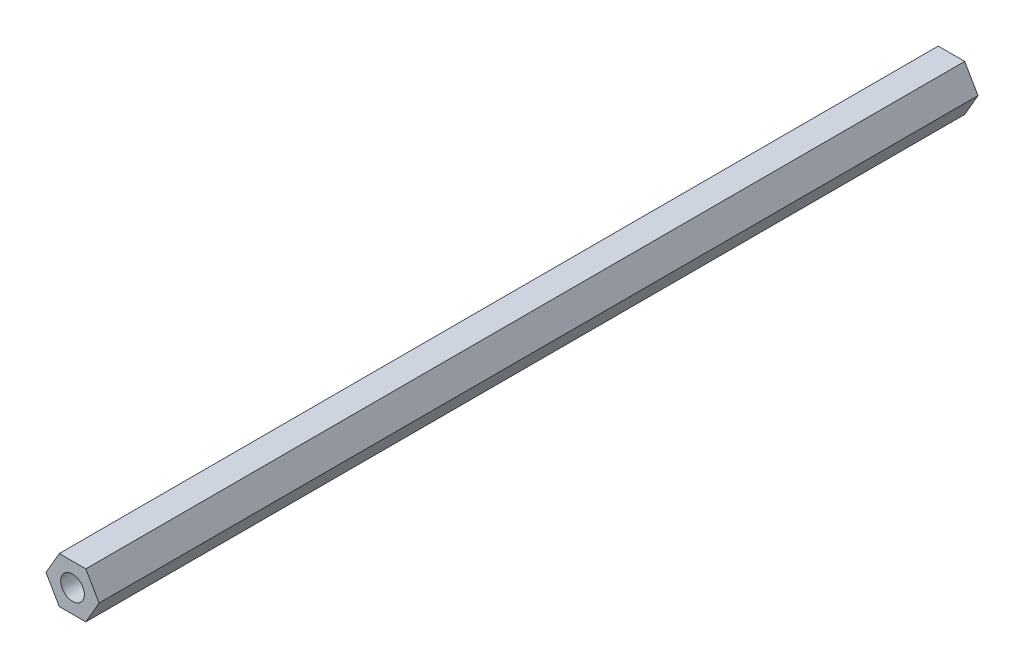
ISO-10303-21;
HEADER;
FILE_DESCRIPTION(('STEP AP214'),'2;1');
FILE_NAME('part.step','',(''),(''),'','','');
FILE_SCHEMA(('AUTOMOTIVE_DESIGN { 1 0 10303 214 1 1 1 1 }'));
ENDSEC;
DATA;
#1=APPLICATION_CONTEXT('core data for automotive mechanical design processes');
#2=APPLICATION_PROTOCOL_DEFINITION('international standard','automotive_design',2000,#1);
#3=PRODUCT_CONTEXT('',#1,'mechanical');
#4=PRODUCT('Part','Part','',(#3));
#5=PRODUCT_RELATED_PRODUCT_CATEGORY('part','',(#4));
#6=PRODUCT_DEFINITION_FORMATION('','',#4);
#7=PRODUCT_DEFINITION_CONTEXT('part definition',#1,'design');
#8=PRODUCT_DEFINITION('design','',#6,#7);
#9=PRODUCT_DEFINITION_SHAPE('','',#8);
#10=(LENGTH_UNIT() NAMED_UNIT(*) SI_UNIT(.MILLI.,.METRE.));
#11=(NAMED_UNIT(*) PLANE_ANGLE_UNIT() SI_UNIT($,.RADIAN.));
#12=(NAMED_UNIT(*) SI_UNIT($,.STERADIAN.) SOLID_ANGLE_UNIT());
#13=UNCERTAINTY_MEASURE_WITH_UNIT(LENGTH_MEASURE(1.E-05),#10,'distance_accuracy_value','');
#14=(GEOMETRIC_REPRESENTATION_CONTEXT(3) GLOBAL_UNCERTAINTY_ASSIGNED_CONTEXT((#13)) GLOBAL_UNIT_ASSIGNED_CONTEXT((#10,
#11,#12)) REPRESENTATION_CONTEXT('',''));
#15=CARTESIAN_POINT('',(0.,0.,0.));
#16=DIRECTION('',(0.,0.,1.));
#17=DIRECTION('',(1.,0.,0.));
#18=AXIS2_PLACEMENT_3D('',#15,#16,#17);
#19=CARTESIAN_POINT('',(0.,0.,242.824));
#20=DIRECTION('',(0.,0.,1.));
#21=DIRECTION('',(1.,0.,0.));
#22=AXIS2_PLACEMENT_3D('',#19,#20,#21);
#23=PLANE('',#22);
#24=DIRECTION('',(-0.499999999999995,-0.866025403784442,0.));
#25=VECTOR('',#24,1.);
#26=CARTESIAN_POINT('',(-3.6661742093542,6.34999999999996,242.824));
#27=LINE('',#26,#25);
#28=CARTESIAN_POINT('',(-3.6661742093542,6.34999999999996,242.824));
#29=VERTEX_POINT('',#28);
#30=CARTESIAN_POINT('',(-7.33234841870825,0.,242.824));
#31=VERTEX_POINT('',#30);
#32=EDGE_CURVE('E128',#29,#31,#27,.T.);
#33=ORIENTED_EDGE('',*,*,#32,.T.);
#34=DIRECTION('',(0.500000000000001,-0.866025403784438,0.));
#35=VECTOR('',#34,1.);
#36=CARTESIAN_POINT('',(-7.33234841870825,0.,242.824));
#37=LINE('',#36,#35);
#38=CARTESIAN_POINT('',(-3.66617420935411,-6.35000000000001,242.824));
#39=VERTEX_POINT('',#38);
#40=EDGE_CURVE('E86',#31,#39,#37,.T.);
#41=ORIENTED_EDGE('',*,*,#40,.T.);
#42=DIRECTION('',(1.,0.,0.));
#43=VECTOR('',#42,1.);
#44=CARTESIAN_POINT('',(-3.66617420935411,-6.35000000000001,242.824));
#45=LINE('',#44,#43);
#46=CARTESIAN_POINT('',(3.66617420935415,-6.34999999999998,242.824));
#47=VERTEX_POINT('',#46);
#48=EDGE_CURVE('E99',#39,#47,#45,.T.);
#49=ORIENTED_EDGE('',*,*,#48,.T.);
#50=DIRECTION('',(0.499999999999995,0.866025403784442,0.));
#51=VECTOR('',#50,1.);
#52=CARTESIAN_POINT('',(3.66617420935415,-6.34999999999998,242.824));
#53=LINE('',#52,#51);
#54=CARTESIAN_POINT('',(7.33234841870825,0.,242.824));
#55=VERTEX_POINT('',#54);
#56=EDGE_CURVE('E93',#47,#55,#53,.T.);
#57=ORIENTED_EDGE('',*,*,#56,.T.);
#58=DIRECTION('',(-0.500000000000007,0.866025403784434,0.));
#59=VECTOR('',#58,1.);
#60=CARTESIAN_POINT('',(7.33234841870825,0.,242.824));
#61=LINE('',#60,#59);
#62=CARTESIAN_POINT('',(3.66617420935407,6.35000000000003,242.824));
#63=VERTEX_POINT('',#62);
#64=EDGE_CURVE('E97',#55,#63,#61,.T.);
#65=ORIENTED_EDGE('',*,*,#64,.T.);
#66=DIRECTION('',(-1.,0.,0.));
#67=VECTOR('',#66,1.);
#68=CARTESIAN_POINT('',(3.66617420935407,6.35000000000003,242.824));
#69=LINE('',#68,#67);
#70=EDGE_CURVE('E49',#63,#29,#69,.T.);
#71=ORIENTED_EDGE('',*,*,#70,.T.);
#72=EDGE_LOOP('',(#33,#41,#49,#57,#65,#71));
#73=FACE_BOUND('',#72,.T.);
#74=CARTESIAN_POINT('',(0.,0.,242.824));
#75=DIRECTION('',(0.,0.,1.));
#76=DIRECTION('',(1.,0.,0.));
#77=AXIS2_PLACEMENT_3D('',#74,#75,#76);
#78=CIRCLE('',#77,3.2639);
#79=CARTESIAN_POINT('',(3.2639,0.,242.824));
#80=VERTEX_POINT('',#79);
#81=EDGE_CURVE('E121',#80,#80,#78,.T.);
#82=ORIENTED_EDGE('',*,*,#81,.F.);
#83=EDGE_LOOP('',(#82));
#84=FACE_BOUND('',#83,.T.);
#85=ADVANCED_FACE('F32',(#73,#84),#23,.T.);
#86=CARTESIAN_POINT('',(0.,0.,0.));
#87=DIRECTION('',(0.,0.,1.));
#88=DIRECTION('',(1.,0.,0.));
#89=AXIS2_PLACEMENT_3D('',#86,#87,#88);
#90=PLANE('',#89);
#91=DIRECTION('',(-0.499999999999995,-0.866025403784442,0.));
#92=VECTOR('',#91,1.);
#93=CARTESIAN_POINT('',(-3.6661742093542,6.34999999999996,0.));
#94=LINE('',#93,#92);
#95=CARTESIAN_POINT('',(-3.6661742093542,6.34999999999996,0.));
#96=VERTEX_POINT('',#95);
#97=CARTESIAN_POINT('',(-7.33234841870825,0.,0.));
#98=VERTEX_POINT('',#97);
#99=EDGE_CURVE('E117',#96,#98,#94,.T.);
#100=ORIENTED_EDGE('',*,*,#99,.F.);
#101=DIRECTION('',(-1.,0.,0.));
#102=VECTOR('',#101,1.);
#103=CARTESIAN_POINT('',(3.66617420935407,6.35000000000003,0.));
#104=LINE('',#103,#102);
#105=CARTESIAN_POINT('',(3.66617420935407,6.35000000000003,0.));
#106=VERTEX_POINT('',#105);
#107=EDGE_CURVE('E78',#106,#96,#104,.T.);
#108=ORIENTED_EDGE('',*,*,#107,.F.);
#109=DIRECTION('',(-0.500000000000007,0.866025403784434,0.));
#110=VECTOR('',#109,1.);
#111=CARTESIAN_POINT('',(7.33234841870825,0.,0.));
#112=LINE('',#111,#110);
#113=CARTESIAN_POINT('',(7.33234841870825,0.,0.));
#114=VERTEX_POINT('',#113);
#115=EDGE_CURVE('E72',#114,#106,#112,.T.);
#116=ORIENTED_EDGE('',*,*,#115,.F.);
#117=DIRECTION('',(0.499999999999995,0.866025403784442,0.));
#118=VECTOR('',#117,1.);
#119=CARTESIAN_POINT('',(3.66617420935415,-6.34999999999998,0.));
#120=LINE('',#119,#118);
#121=CARTESIAN_POINT('',(3.66617420935415,-6.34999999999998,0.));
#122=VERTEX_POINT('',#121);
#123=EDGE_CURVE('E107',#122,#114,#120,.T.);
#124=ORIENTED_EDGE('',*,*,#123,.F.);
#125=DIRECTION('',(1.,0.,0.));
#126=VECTOR('',#125,1.);
#127=CARTESIAN_POINT('',(-3.66617420935411,-6.35000000000001,0.));
#128=LINE('',#127,#126);
#129=CARTESIAN_POINT('',(-3.66617420935411,-6.35000000000001,0.));
#130=VERTEX_POINT('',#129);
#131=EDGE_CURVE('E123',#130,#122,#128,.T.);
#132=ORIENTED_EDGE('',*,*,#131,.F.);
#133=DIRECTION('',(0.500000000000001,-0.866025403784438,0.));
#134=VECTOR('',#133,1.);
#135=CARTESIAN_POINT('',(-7.33234841870825,0.,0.));
#136=LINE('',#135,#134);
#137=EDGE_CURVE('E120',#98,#130,#136,.T.);
#138=ORIENTED_EDGE('',*,*,#137,.F.);
#139=EDGE_LOOP('',(#100,#108,#116,#124,#132,#138));
#140=FACE_BOUND('',#139,.T.);
#141=CARTESIAN_POINT('',(0.,0.,0.));
#142=DIRECTION('',(0.,0.,1.));
#143=DIRECTION('',(1.,0.,0.));
#144=AXIS2_PLACEMENT_3D('',#141,#142,#143);
#145=CIRCLE('',#144,3.2639);
#146=CARTESIAN_POINT('',(3.2639,0.,0.));
#147=VERTEX_POINT('',#146);
#148=EDGE_CURVE('E221',#147,#147,#145,.T.);
#149=ORIENTED_EDGE('',*,*,#148,.T.);
#150=EDGE_LOOP('',(#149));
#151=FACE_BOUND('',#150,.T.);
#152=ADVANCED_FACE('F137',(#140,#151),#90,.F.);
#153=CARTESIAN_POINT('',(-3.6661742093542,6.34999999999996,242.824));
#154=DIRECTION('',(0.866025403784441,-0.499999999999995,0.));
#155=DIRECTION('',(0.499999999999995,0.866025403784442,0.));
#156=AXIS2_PLACEMENT_3D('',#153,#154,#155);
#157=PLANE('',#156);
#158=ORIENTED_EDGE('',*,*,#99,.T.);
#159=DIRECTION('',(0.,0.,-1.));
#160=VECTOR('',#159,1.);
#161=CARTESIAN_POINT('',(-7.33234841870825,0.,242.824));
#162=LINE('',#161,#160);
#163=EDGE_CURVE('E11',#31,#98,#162,.T.);
#164=ORIENTED_EDGE('',*,*,#163,.F.);
#165=ORIENTED_EDGE('',*,*,#32,.F.);
#166=DIRECTION('',(0.,0.,-1.));
#167=VECTOR('',#166,1.);
#168=CARTESIAN_POINT('',(-3.6661742093542,6.34999999999996,242.824));
#169=LINE('',#168,#167);
#170=EDGE_CURVE('E113',#29,#96,#169,.T.);
#171=ORIENTED_EDGE('',*,*,#170,.T.);
#172=EDGE_LOOP('',(#158,#164,#165,#171));
#173=FACE_BOUND('',#172,.T.);
#174=ADVANCED_FACE('F34',(#173),#157,.F.);
#175=CARTESIAN_POINT('',(-7.33234841870825,0.,242.824));
#176=DIRECTION('',(0.866025403784438,0.500000000000001,0.));
#177=DIRECTION('',(-0.500000000000001,0.866025403784438,0.));
#178=AXIS2_PLACEMENT_3D('',#175,#176,#177);
#179=PLANE('',#178);
#180=ORIENTED_EDGE('',*,*,#137,.T.);
#181=DIRECTION('',(0.,0.,-1.));
#182=VECTOR('',#181,1.);
#183=CARTESIAN_POINT('',(-3.66617420935411,-6.35000000000001,242.824));
#184=LINE('',#183,#182);
#185=EDGE_CURVE('E41',#39,#130,#184,.T.);
#186=ORIENTED_EDGE('',*,*,#185,.F.);
#187=ORIENTED_EDGE('',*,*,#40,.F.);
#188=ORIENTED_EDGE('',*,*,#163,.T.);
#189=EDGE_LOOP('',(#180,#186,#187,#188));
#190=FACE_BOUND('',#189,.T.);
#191=ADVANCED_FACE('F162',(#190),#179,.F.);
#192=CARTESIAN_POINT('',(-3.66617420935411,-6.35000000000001,242.824));
#193=DIRECTION('',(0.,1.,0.));
#194=DIRECTION('',(-1.,0.,0.));
#195=AXIS2_PLACEMENT_3D('',#192,#193,#194);
#196=PLANE('',#195);
#197=ORIENTED_EDGE('',*,*,#131,.T.);
#198=DIRECTION('',(0.,0.,-1.));
#199=VECTOR('',#198,1.);
#200=CARTESIAN_POINT('',(3.66617420935415,-6.34999999999998,242.824));
#201=LINE('',#200,#199);
#202=EDGE_CURVE('E108',#47,#122,#201,.T.);
#203=ORIENTED_EDGE('',*,*,#202,.F.);
#204=ORIENTED_EDGE('',*,*,#48,.F.);
#205=ORIENTED_EDGE('',*,*,#185,.T.);
#206=EDGE_LOOP('',(#197,#203,#204,#205));
#207=FACE_BOUND('',#206,.T.);
#208=ADVANCED_FACE('F134',(#207),#196,.F.);
#209=CARTESIAN_POINT('',(3.66617420935415,-6.34999999999998,242.824));
#210=DIRECTION('',(-0.866025403784441,0.499999999999995,0.));
#211=DIRECTION('',(-0.499999999999995,-0.866025403784442,0.));
#212=AXIS2_PLACEMENT_3D('',#209,#210,#211);
#213=PLANE('',#212);
#214=ORIENTED_EDGE('',*,*,#123,.T.);
#215=DIRECTION('',(0.,0.,-1.));
#216=VECTOR('',#215,1.);
#217=CARTESIAN_POINT('',(7.33234841870825,0.,242.824));
#218=LINE('',#217,#216);
#219=EDGE_CURVE('E104',#55,#114,#218,.T.);
#220=ORIENTED_EDGE('',*,*,#219,.F.);
#221=ORIENTED_EDGE('',*,*,#56,.F.);
#222=ORIENTED_EDGE('',*,*,#202,.T.);
#223=EDGE_LOOP('',(#214,#220,#221,#222));
#224=FACE_BOUND('',#223,.T.);
#225=ADVANCED_FACE('F105',(#224),#213,.F.);
#226=CARTESIAN_POINT('',(7.33234841870825,0.,242.824));
#227=DIRECTION('',(-0.866025403784434,-0.500000000000007,0.));
#228=DIRECTION('',(0.500000000000007,-0.866025403784435,0.));
#229=AXIS2_PLACEMENT_3D('',#226,#227,#228);
#230=PLANE('',#229);
#231=ORIENTED_EDGE('',*,*,#115,.T.);
#232=DIRECTION('',(0.,0.,-1.));
#233=VECTOR('',#232,1.);
#234=CARTESIAN_POINT('',(3.66617420935407,6.35000000000003,242.824));
#235=LINE('',#234,#233);
#236=EDGE_CURVE('E109',#63,#106,#235,.T.);
#237=ORIENTED_EDGE('',*,*,#236,.F.);
#238=ORIENTED_EDGE('',*,*,#64,.F.);
#239=ORIENTED_EDGE('',*,*,#219,.T.);
#240=EDGE_LOOP('',(#231,#237,#238,#239));
#241=FACE_BOUND('',#240,.T.);
#242=ADVANCED_FACE('F111',(#241),#230,.F.);
#243=CARTESIAN_POINT('',(3.66617420935407,6.35000000000003,242.824));
#244=DIRECTION('',(0.,-1.,0.));
#245=DIRECTION('',(1.,0.,0.));
#246=AXIS2_PLACEMENT_3D('',#243,#244,#245);
#247=PLANE('',#246);
#248=ORIENTED_EDGE('',*,*,#107,.T.);
#249=ORIENTED_EDGE('',*,*,#170,.F.);
#250=ORIENTED_EDGE('',*,*,#70,.F.);
#251=ORIENTED_EDGE('',*,*,#236,.T.);
#252=EDGE_LOOP('',(#248,#249,#250,#251));
#253=FACE_BOUND('',#252,.T.);
#254=ADVANCED_FACE('F142',(#253),#247,.F.);
#255=CARTESIAN_POINT('',(0.,0.,242.824));
#256=DIRECTION('',(0.,0.,-1.));
#257=DIRECTION('',(-1.,0.,0.));
#258=AXIS2_PLACEMENT_3D('',#255,#256,#257);
#259=CYLINDRICAL_SURFACE('',#258,3.2639);
#260=ORIENTED_EDGE('',*,*,#81,.T.);
#261=EDGE_LOOP('',(#260));
#262=FACE_BOUND('',#261,.T.);
#263=ORIENTED_EDGE('',*,*,#148,.F.);
#264=EDGE_LOOP('',(#263));
#265=FACE_BOUND('',#264,.T.);
#266=ADVANCED_FACE('F144',(#262,#265),#259,.F.);
#267=CLOSED_SHELL('',(#85,#152,#174,#191,#208,#225,#242,#254,#266));
#268=MANIFOLD_SOLID_BREP('B2',#267);
#269=ADVANCED_BREP_SHAPE_REPRESENTATION('',(#18,#268),#14);
#270=SHAPE_DEFINITION_REPRESENTATION(#9,#269);
ENDSEC;
END-ISO-10303-21;
